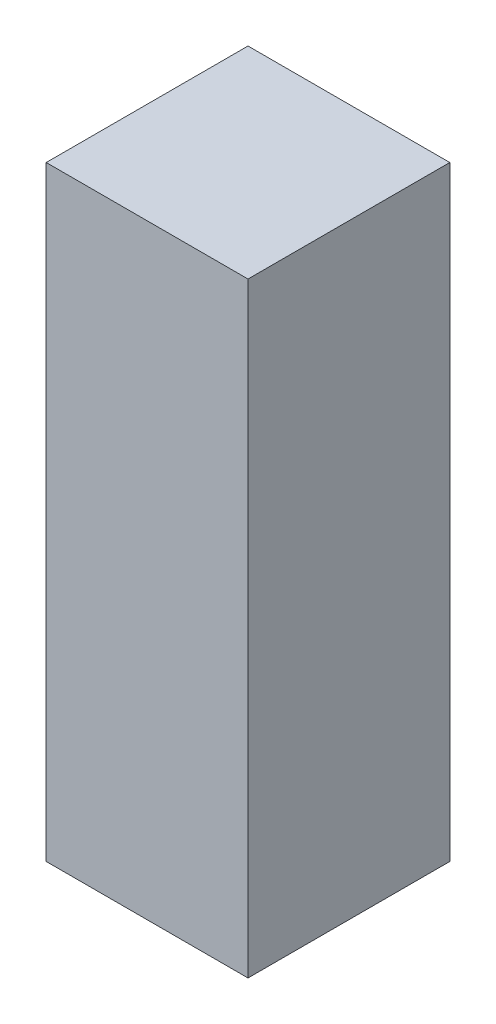
ISO-10303-21;
HEADER;
FILE_DESCRIPTION(('STEP AP214'),'2;1');
FILE_NAME('part.step','',(''),(''),'','','');
FILE_SCHEMA(('AUTOMOTIVE_DESIGN { 1 0 10303 214 1 1 1 1 }'));
ENDSEC;
DATA;
#1=APPLICATION_CONTEXT('core data for automotive mechanical design processes');
#2=APPLICATION_PROTOCOL_DEFINITION('international standard','automotive_design',2000,#1);
#3=PRODUCT_CONTEXT('',#1,'mechanical');
#4=PRODUCT('Part','Part','',(#3));
#5=PRODUCT_RELATED_PRODUCT_CATEGORY('part','',(#4));
#6=PRODUCT_DEFINITION_FORMATION('','',#4);
#7=PRODUCT_DEFINITION_CONTEXT('part definition',#1,'design');
#8=PRODUCT_DEFINITION('design','',#6,#7);
#9=PRODUCT_DEFINITION_SHAPE('','',#8);
#10=(LENGTH_UNIT() NAMED_UNIT(*) SI_UNIT(.MILLI.,.METRE.));
#11=(NAMED_UNIT(*) PLANE_ANGLE_UNIT() SI_UNIT($,.RADIAN.));
#12=(NAMED_UNIT(*) SI_UNIT($,.STERADIAN.) SOLID_ANGLE_UNIT());
#13=UNCERTAINTY_MEASURE_WITH_UNIT(LENGTH_MEASURE(1.E-05),#10,'distance_accuracy_value','');
#14=(GEOMETRIC_REPRESENTATION_CONTEXT(3) GLOBAL_UNCERTAINTY_ASSIGNED_CONTEXT((#13)) GLOBAL_UNIT_ASSIGNED_CONTEXT((#10,
#11,#12)) REPRESENTATION_CONTEXT('',''));
#15=CARTESIAN_POINT('',(0.,0.,0.));
#16=DIRECTION('',(0.,0.,1.));
#17=DIRECTION('',(1.,0.,0.));
#18=AXIS2_PLACEMENT_3D('',#15,#16,#17);
#19=CARTESIAN_POINT('',(0.,75.,0.));
#20=DIRECTION('',(1.,0.,0.));
#21=DIRECTION('',(0.,0.,-1.));
#22=AXIS2_PLACEMENT_3D('',#19,#20,#21);
#23=PLANE('',#22);
#24=DIRECTION('',(0.,0.,1.));
#25=VECTOR('',#24,1.);
#26=CARTESIAN_POINT('',(0.,0.,0.));
#27=LINE('',#26,#25);
#28=CARTESIAN_POINT('',(0.,0.,-25.));
#29=VERTEX_POINT('',#28);
#30=CARTESIAN_POINT('',(0.,0.,0.));
#31=VERTEX_POINT('',#30);
#32=EDGE_CURVE('E98',#29,#31,#27,.T.);
#33=ORIENTED_EDGE('',*,*,#32,.T.);
#34=DIRECTION('',(0.,-1.,0.));
#35=VECTOR('',#34,1.);
#36=CARTESIAN_POINT('',(0.,75.,0.));
#37=LINE('',#36,#35);
#38=CARTESIAN_POINT('',(0.,75.,0.));
#39=VERTEX_POINT('',#38);
#40=EDGE_CURVE('E11',#39,#31,#37,.T.);
#41=ORIENTED_EDGE('',*,*,#40,.F.);
#42=DIRECTION('',(0.,0.,1.));
#43=VECTOR('',#42,1.);
#44=CARTESIAN_POINT('',(0.,75.,0.));
#45=LINE('',#44,#43);
#46=CARTESIAN_POINT('',(0.,75.,-25.));
#47=VERTEX_POINT('',#46);
#48=EDGE_CURVE('E86',#47,#39,#45,.T.);
#49=ORIENTED_EDGE('',*,*,#48,.F.);
#50=DIRECTION('',(0.,-1.,0.));
#51=VECTOR('',#50,1.);
#52=CARTESIAN_POINT('',(0.,75.,-25.));
#53=LINE('',#52,#51);
#54=EDGE_CURVE('E94',#47,#29,#53,.T.);
#55=ORIENTED_EDGE('',*,*,#54,.T.);
#56=EDGE_LOOP('',(#33,#41,#49,#55));
#57=FACE_BOUND('',#56,.T.);
#58=ADVANCED_FACE('F35',(#57),#23,.F.);
#59=CARTESIAN_POINT('',(0.,75.,0.));
#60=DIRECTION('',(0.,0.,-1.));
#61=DIRECTION('',(-1.,0.,0.));
#62=AXIS2_PLACEMENT_3D('',#59,#60,#61);
#63=PLANE('',#62);
#64=DIRECTION('',(1.,0.,0.));
#65=VECTOR('',#64,1.);
#66=CARTESIAN_POINT('',(0.,0.,0.));
#67=LINE('',#66,#65);
#68=CARTESIAN_POINT('',(25.,0.,0.));
#69=VERTEX_POINT('',#68);
#70=EDGE_CURVE('E90',#31,#69,#67,.T.);
#71=ORIENTED_EDGE('',*,*,#70,.T.);
#72=DIRECTION('',(0.,-1.,0.));
#73=VECTOR('',#72,1.);
#74=CARTESIAN_POINT('',(25.,75.,0.));
#75=LINE('',#74,#73);
#76=CARTESIAN_POINT('',(25.,75.,0.));
#77=VERTEX_POINT('',#76);
#78=EDGE_CURVE('E43',#77,#69,#75,.T.);
#79=ORIENTED_EDGE('',*,*,#78,.F.);
#80=DIRECTION('',(1.,0.,0.));
#81=VECTOR('',#80,1.);
#82=CARTESIAN_POINT('',(0.,75.,0.));
#83=LINE('',#82,#81);
#84=EDGE_CURVE('E81',#39,#77,#83,.T.);
#85=ORIENTED_EDGE('',*,*,#84,.F.);
#86=ORIENTED_EDGE('',*,*,#40,.T.);
#87=EDGE_LOOP('',(#71,#79,#85,#86));
#88=FACE_BOUND('',#87,.T.);
#89=ADVANCED_FACE('F89',(#88),#63,.F.);
#90=CARTESIAN_POINT('',(25.,75.,0.));
#91=DIRECTION('',(-1.,0.,0.));
#92=DIRECTION('',(0.,0.,1.));
#93=AXIS2_PLACEMENT_3D('',#90,#91,#92);
#94=PLANE('',#93);
#95=DIRECTION('',(0.,0.,-1.));
#96=VECTOR('',#95,1.);
#97=CARTESIAN_POINT('',(25.,0.,0.));
#98=LINE('',#97,#96);
#99=CARTESIAN_POINT('',(25.,0.,-25.));
#100=VERTEX_POINT('',#99);
#101=EDGE_CURVE('E68',#69,#100,#98,.T.);
#102=ORIENTED_EDGE('',*,*,#101,.T.);
#103=DIRECTION('',(0.,-1.,0.));
#104=VECTOR('',#103,1.);
#105=CARTESIAN_POINT('',(25.,75.,-25.));
#106=LINE('',#105,#104);
#107=CARTESIAN_POINT('',(25.,75.,-25.));
#108=VERTEX_POINT('',#107);
#109=EDGE_CURVE('E91',#108,#100,#106,.T.);
#110=ORIENTED_EDGE('',*,*,#109,.F.);
#111=DIRECTION('',(0.,0.,-1.));
#112=VECTOR('',#111,1.);
#113=CARTESIAN_POINT('',(25.,75.,0.));
#114=LINE('',#113,#112);
#115=EDGE_CURVE('E84',#77,#108,#114,.T.);
#116=ORIENTED_EDGE('',*,*,#115,.F.);
#117=ORIENTED_EDGE('',*,*,#78,.T.);
#118=EDGE_LOOP('',(#102,#110,#116,#117));
#119=FACE_BOUND('',#118,.T.);
#120=ADVANCED_FACE('F92',(#119),#94,.F.);
#121=CARTESIAN_POINT('',(0.,75.,-25.));
#122=DIRECTION('',(0.,0.,1.));
#123=DIRECTION('',(1.,0.,0.));
#124=AXIS2_PLACEMENT_3D('',#121,#122,#123);
#125=PLANE('',#124);
#126=DIRECTION('',(-1.,0.,0.));
#127=VECTOR('',#126,1.);
#128=CARTESIAN_POINT('',(0.,0.,-25.));
#129=LINE('',#128,#127);
#130=EDGE_CURVE('E74',#100,#29,#129,.T.);
#131=ORIENTED_EDGE('',*,*,#130,.T.);
#132=ORIENTED_EDGE('',*,*,#54,.F.);
#133=DIRECTION('',(-1.,0.,0.));
#134=VECTOR('',#133,1.);
#135=CARTESIAN_POINT('',(0.,75.,-25.));
#136=LINE('',#135,#134);
#137=EDGE_CURVE('E51',#108,#47,#136,.T.);
#138=ORIENTED_EDGE('',*,*,#137,.F.);
#139=ORIENTED_EDGE('',*,*,#109,.T.);
#140=EDGE_LOOP('',(#131,#132,#138,#139));
#141=FACE_BOUND('',#140,.T.);
#142=ADVANCED_FACE('F105',(#141),#125,.F.);
#143=CARTESIAN_POINT('',(0.,75.,0.));
#144=DIRECTION('',(0.,-1.,0.));
#145=DIRECTION('',(0.,0.,-1.));
#146=AXIS2_PLACEMENT_3D('',#143,#144,#145);
#147=PLANE('',#146);
#148=ORIENTED_EDGE('',*,*,#48,.T.);
#149=ORIENTED_EDGE('',*,*,#84,.T.);
#150=ORIENTED_EDGE('',*,*,#115,.T.);
#151=ORIENTED_EDGE('',*,*,#137,.T.);
#152=EDGE_LOOP('',(#148,#149,#150,#151));
#153=FACE_BOUND('',#152,.T.);
#154=ADVANCED_FACE('F82',(#153),#147,.F.);
#155=CARTESIAN_POINT('',(0.,0.,0.));
#156=DIRECTION('',(0.,-1.,0.));
#157=DIRECTION('',(0.,0.,-1.));
#158=AXIS2_PLACEMENT_3D('',#155,#156,#157);
#159=PLANE('',#158);
#160=ORIENTED_EDGE('',*,*,#32,.F.);
#161=ORIENTED_EDGE('',*,*,#130,.F.);
#162=ORIENTED_EDGE('',*,*,#101,.F.);
#163=ORIENTED_EDGE('',*,*,#70,.F.);
#164=EDGE_LOOP('',(#160,#161,#162,#163));
#165=FACE_BOUND('',#164,.T.);
#166=ADVANCED_FACE('F108',(#165),#159,.T.);
#167=CLOSED_SHELL('',(#58,#89,#120,#142,#154,#166));
#168=MANIFOLD_SOLID_BREP('B2',#167);
#169=ADVANCED_BREP_SHAPE_REPRESENTATION('',(#18,#168),#14);
#170=SHAPE_DEFINITION_REPRESENTATION(#9,#169);
ENDSEC;
END-ISO-10303-21;
